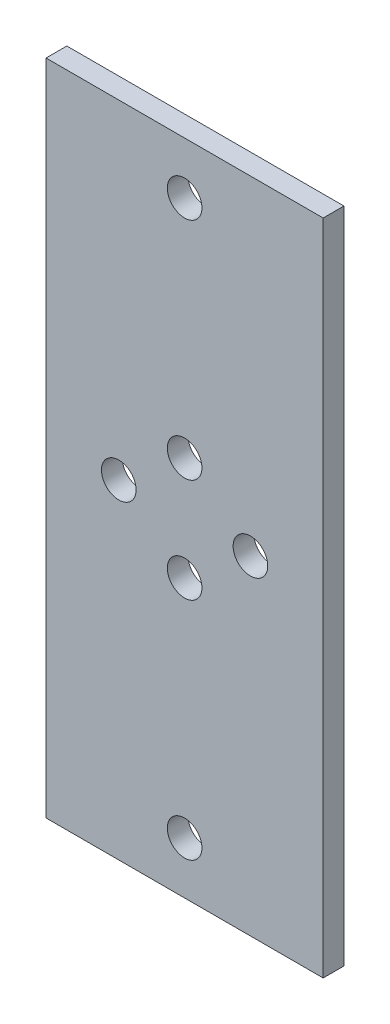
ISO-10303-21;
HEADER;
FILE_DESCRIPTION(('STEP AP214'),'2;1');
FILE_NAME('part.step','',(''),(''),'','','');
FILE_SCHEMA(('AUTOMOTIVE_DESIGN { 1 0 10303 214 1 1 1 1 }'));
ENDSEC;
DATA;
#1=APPLICATION_CONTEXT('core data for automotive mechanical design processes');
#2=APPLICATION_PROTOCOL_DEFINITION('international standard','automotive_design',2000,#1);
#3=PRODUCT_CONTEXT('',#1,'mechanical');
#4=PRODUCT('Part','Part','',(#3));
#5=PRODUCT_RELATED_PRODUCT_CATEGORY('part','',(#4));
#6=PRODUCT_DEFINITION_FORMATION('','',#4);
#7=PRODUCT_DEFINITION_CONTEXT('part definition',#1,'design');
#8=PRODUCT_DEFINITION('design','',#6,#7);
#9=PRODUCT_DEFINITION_SHAPE('','',#8);
#10=(LENGTH_UNIT() NAMED_UNIT(*) SI_UNIT(.MILLI.,.METRE.));
#11=(NAMED_UNIT(*) PLANE_ANGLE_UNIT() SI_UNIT($,.RADIAN.));
#12=(NAMED_UNIT(*) SI_UNIT($,.STERADIAN.) SOLID_ANGLE_UNIT());
#13=UNCERTAINTY_MEASURE_WITH_UNIT(LENGTH_MEASURE(1.E-05),#10,'distance_accuracy_value','');
#14=(GEOMETRIC_REPRESENTATION_CONTEXT(3) GLOBAL_UNCERTAINTY_ASSIGNED_CONTEXT((#13)) GLOBAL_UNIT_ASSIGNED_CONTEXT((#10,
#11,#12)) REPRESENTATION_CONTEXT('',''));
#15=CARTESIAN_POINT('',(0.,0.,0.));
#16=DIRECTION('',(0.,0.,1.));
#17=DIRECTION('',(1.,0.,0.));
#18=AXIS2_PLACEMENT_3D('',#15,#16,#17);
#19=CARTESIAN_POINT('',(0.,0.,3.));
#20=DIRECTION('',(1.,0.,0.));
#21=DIRECTION('',(0.,0.,-1.));
#22=AXIS2_PLACEMENT_3D('',#19,#20,#21);
#23=PLANE('',#22);
#24=DIRECTION('',(0.,-1.,0.));
#25=VECTOR('',#24,1.);
#26=CARTESIAN_POINT('',(0.,0.,0.));
#27=LINE('',#26,#25);
#28=CARTESIAN_POINT('',(0.,95.,0.));
#29=VERTEX_POINT('',#28);
#30=CARTESIAN_POINT('',(0.,0.,0.));
#31=VERTEX_POINT('',#30);
#32=EDGE_CURVE('E100',#29,#31,#27,.T.);
#33=ORIENTED_EDGE('',*,*,#32,.T.);
#34=DIRECTION('',(0.,0.,-1.));
#35=VECTOR('',#34,1.);
#36=CARTESIAN_POINT('',(0.,0.,3.));
#37=LINE('',#36,#35);
#38=CARTESIAN_POINT('',(0.,0.,3.));
#39=VERTEX_POINT('',#38);
#40=EDGE_CURVE('E11',#39,#31,#37,.T.);
#41=ORIENTED_EDGE('',*,*,#40,.F.);
#42=DIRECTION('',(0.,-1.,0.));
#43=VECTOR('',#42,1.);
#44=CARTESIAN_POINT('',(0.,0.,3.));
#45=LINE('',#44,#43);
#46=CARTESIAN_POINT('',(0.,95.,3.));
#47=VERTEX_POINT('',#46);
#48=EDGE_CURVE('E88',#47,#39,#45,.T.);
#49=ORIENTED_EDGE('',*,*,#48,.F.);
#50=DIRECTION('',(0.,0.,-1.));
#51=VECTOR('',#50,1.);
#52=CARTESIAN_POINT('',(0.,95.,3.));
#53=LINE('',#52,#51);
#54=EDGE_CURVE('E96',#47,#29,#53,.T.);
#55=ORIENTED_EDGE('',*,*,#54,.T.);
#56=EDGE_LOOP('',(#33,#41,#49,#55));
#57=FACE_BOUND('',#56,.T.);
#58=ADVANCED_FACE('F37',(#57),#23,.F.);
#59=CARTESIAN_POINT('',(0.,0.,3.));
#60=DIRECTION('',(0.,1.,0.));
#61=DIRECTION('',(0.,0.,1.));
#62=AXIS2_PLACEMENT_3D('',#59,#60,#61);
#63=PLANE('',#62);
#64=DIRECTION('',(1.,0.,0.));
#65=VECTOR('',#64,1.);
#66=CARTESIAN_POINT('',(0.,0.,0.));
#67=LINE('',#66,#65);
#68=CARTESIAN_POINT('',(40.,0.,0.));
#69=VERTEX_POINT('',#68);
#70=EDGE_CURVE('E92',#31,#69,#67,.T.);
#71=ORIENTED_EDGE('',*,*,#70,.T.);
#72=DIRECTION('',(0.,0.,-1.));
#73=VECTOR('',#72,1.);
#74=CARTESIAN_POINT('',(40.,0.,3.));
#75=LINE('',#74,#73);
#76=CARTESIAN_POINT('',(40.,0.,3.));
#77=VERTEX_POINT('',#76);
#78=EDGE_CURVE('E45',#77,#69,#75,.T.);
#79=ORIENTED_EDGE('',*,*,#78,.F.);
#80=DIRECTION('',(1.,0.,0.));
#81=VECTOR('',#80,1.);
#82=CARTESIAN_POINT('',(0.,0.,3.));
#83=LINE('',#82,#81);
#84=EDGE_CURVE('E83',#39,#77,#83,.T.);
#85=ORIENTED_EDGE('',*,*,#84,.F.);
#86=ORIENTED_EDGE('',*,*,#40,.T.);
#87=EDGE_LOOP('',(#71,#79,#85,#86));
#88=FACE_BOUND('',#87,.T.);
#89=ADVANCED_FACE('F91',(#88),#63,.F.);
#90=CARTESIAN_POINT('',(40.,0.,3.));
#91=DIRECTION('',(-1.,0.,0.));
#92=DIRECTION('',(0.,0.,1.));
#93=AXIS2_PLACEMENT_3D('',#90,#91,#92);
#94=PLANE('',#93);
#95=DIRECTION('',(0.,1.,0.));
#96=VECTOR('',#95,1.);
#97=CARTESIAN_POINT('',(40.,0.,0.));
#98=LINE('',#97,#96);
#99=CARTESIAN_POINT('',(40.,95.,0.));
#100=VERTEX_POINT('',#99);
#101=EDGE_CURVE('E70',#69,#100,#98,.T.);
#102=ORIENTED_EDGE('',*,*,#101,.T.);
#103=DIRECTION('',(0.,0.,-1.));
#104=VECTOR('',#103,1.);
#105=CARTESIAN_POINT('',(40.,95.,3.));
#106=LINE('',#105,#104);
#107=CARTESIAN_POINT('',(40.,95.,3.));
#108=VERTEX_POINT('',#107);
#109=EDGE_CURVE('E93',#108,#100,#106,.T.);
#110=ORIENTED_EDGE('',*,*,#109,.F.);
#111=DIRECTION('',(0.,1.,0.));
#112=VECTOR('',#111,1.);
#113=CARTESIAN_POINT('',(40.,0.,3.));
#114=LINE('',#113,#112);
#115=EDGE_CURVE('E86',#77,#108,#114,.T.);
#116=ORIENTED_EDGE('',*,*,#115,.F.);
#117=ORIENTED_EDGE('',*,*,#78,.T.);
#118=EDGE_LOOP('',(#102,#110,#116,#117));
#119=FACE_BOUND('',#118,.T.);
#120=ADVANCED_FACE('F94',(#119),#94,.F.);
#121=CARTESIAN_POINT('',(0.,95.,3.));
#122=DIRECTION('',(0.,-1.,0.));
#123=DIRECTION('',(0.,0.,-1.));
#124=AXIS2_PLACEMENT_3D('',#121,#122,#123);
#125=PLANE('',#124);
#126=DIRECTION('',(-1.,0.,0.));
#127=VECTOR('',#126,1.);
#128=CARTESIAN_POINT('',(0.,95.,0.));
#129=LINE('',#128,#127);
#130=EDGE_CURVE('E76',#100,#29,#129,.T.);
#131=ORIENTED_EDGE('',*,*,#130,.T.);
#132=ORIENTED_EDGE('',*,*,#54,.F.);
#133=DIRECTION('',(-1.,0.,0.));
#134=VECTOR('',#133,1.);
#135=CARTESIAN_POINT('',(0.,95.,3.));
#136=LINE('',#135,#134);
#137=EDGE_CURVE('E53',#108,#47,#136,.T.);
#138=ORIENTED_EDGE('',*,*,#137,.F.);
#139=ORIENTED_EDGE('',*,*,#109,.T.);
#140=EDGE_LOOP('',(#131,#132,#138,#139));
#141=FACE_BOUND('',#140,.T.);
#142=ADVANCED_FACE('F108',(#141),#125,.F.);
#143=CARTESIAN_POINT('',(0.,0.,3.));
#144=DIRECTION('',(0.,0.,-1.));
#145=DIRECTION('',(-1.,0.,0.));
#146=AXIS2_PLACEMENT_3D('',#143,#144,#145);
#147=PLANE('',#146);
#148=CARTESIAN_POINT('',(20.,87.5,3.));
#149=DIRECTION('',(0.,0.,1.));
#150=DIRECTION('',(1.,0.,0.));
#151=AXIS2_PLACEMENT_3D('',#148,#149,#150);
#152=CIRCLE('',#151,2.5);
#153=CARTESIAN_POINT('',(22.5,87.5,3.));
#154=VERTEX_POINT('',#153);
#155=EDGE_CURVE('E103',#154,#154,#152,.T.);
#156=ORIENTED_EDGE('',*,*,#155,.F.);
#157=EDGE_LOOP('',(#156));
#158=FACE_BOUND('',#157,.T.);
#159=CARTESIAN_POINT('',(20.,40.,3.));
#160=DIRECTION('',(0.,0.,1.));
#161=DIRECTION('',(1.,0.,0.));
#162=AXIS2_PLACEMENT_3D('',#159,#160,#161);
#163=CIRCLE('',#162,2.5);
#164=CARTESIAN_POINT('',(22.5,40.,3.));
#165=VERTEX_POINT('',#164);
#166=EDGE_CURVE('E132',#165,#165,#163,.T.);
#167=ORIENTED_EDGE('',*,*,#166,.F.);
#168=EDGE_LOOP('',(#167));
#169=FACE_BOUND('',#168,.T.);
#170=CARTESIAN_POINT('',(20.,7.49999999999998,3.));
#171=DIRECTION('',(0.,0.,1.));
#172=DIRECTION('',(-1.,0.,0.));
#173=AXIS2_PLACEMENT_3D('',#170,#171,#172);
#174=CIRCLE('',#173,2.5);
#175=CARTESIAN_POINT('',(22.5,7.49999999999998,3.));
#176=VERTEX_POINT('',#175);
#177=EDGE_CURVE('E124',#176,#176,#174,.T.);
#178=ORIENTED_EDGE('',*,*,#177,.F.);
#179=EDGE_LOOP('',(#178));
#180=FACE_BOUND('',#179,.T.);
#181=CARTESIAN_POINT('',(10.5,47.5,3.));
#182=DIRECTION('',(0.,0.,1.));
#183=DIRECTION('',(1.,0.,0.));
#184=AXIS2_PLACEMENT_3D('',#181,#182,#183);
#185=CIRCLE('',#184,2.5);
#186=CARTESIAN_POINT('',(13.,47.5,3.));
#187=VERTEX_POINT('',#186);
#188=EDGE_CURVE('E117',#187,#187,#185,.T.);
#189=ORIENTED_EDGE('',*,*,#188,.F.);
#190=EDGE_LOOP('',(#189));
#191=FACE_BOUND('',#190,.T.);
#192=CARTESIAN_POINT('',(29.5,47.5,3.));
#193=DIRECTION('',(0.,0.,1.));
#194=DIRECTION('',(1.,0.,0.));
#195=AXIS2_PLACEMENT_3D('',#192,#193,#194);
#196=CIRCLE('',#195,2.50000000000001);
#197=CARTESIAN_POINT('',(32.,47.5,3.));
#198=VERTEX_POINT('',#197);
#199=EDGE_CURVE('E118',#198,#198,#196,.T.);
#200=ORIENTED_EDGE('',*,*,#199,.F.);
#201=EDGE_LOOP('',(#200));
#202=FACE_BOUND('',#201,.T.);
#203=CARTESIAN_POINT('',(20.,55.,3.));
#204=DIRECTION('',(0.,0.,1.));
#205=DIRECTION('',(1.,0.,0.));
#206=AXIS2_PLACEMENT_3D('',#203,#204,#205);
#207=CIRCLE('',#206,2.5);
#208=CARTESIAN_POINT('',(22.5,55.,3.));
#209=VERTEX_POINT('',#208);
#210=EDGE_CURVE('E131',#209,#209,#207,.T.);
#211=ORIENTED_EDGE('',*,*,#210,.F.);
#212=EDGE_LOOP('',(#211));
#213=FACE_BOUND('',#212,.T.);
#214=ORIENTED_EDGE('',*,*,#48,.T.);
#215=ORIENTED_EDGE('',*,*,#84,.T.);
#216=ORIENTED_EDGE('',*,*,#115,.T.);
#217=ORIENTED_EDGE('',*,*,#137,.T.);
#218=EDGE_LOOP('',(#214,#215,#216,#217));
#219=FACE_BOUND('',#218,.T.);
#220=ADVANCED_FACE('F84',(#158,#169,#180,#191,#202,#213,#219),#147,.F.);
#221=CARTESIAN_POINT('',(0.,0.,0.));
#222=DIRECTION('',(0.,0.,-1.));
#223=DIRECTION('',(-1.,0.,0.));
#224=AXIS2_PLACEMENT_3D('',#221,#222,#223);
#225=PLANE('',#224);
#226=CARTESIAN_POINT('',(20.,87.5,0.));
#227=DIRECTION('',(0.,0.,-1.));
#228=DIRECTION('',(-1.,0.,0.));
#229=AXIS2_PLACEMENT_3D('',#226,#227,#228);
#230=CIRCLE('',#229,2.5);
#231=CARTESIAN_POINT('',(22.5,87.5,0.));
#232=VERTEX_POINT('',#231);
#233=EDGE_CURVE('E127',#232,#232,#230,.F.);
#234=ORIENTED_EDGE('',*,*,#233,.T.);
#235=EDGE_LOOP('',(#234));
#236=FACE_BOUND('',#235,.T.);
#237=CARTESIAN_POINT('',(20.,40.,0.));
#238=DIRECTION('',(0.,0.,-1.));
#239=DIRECTION('',(-1.,0.,0.));
#240=AXIS2_PLACEMENT_3D('',#237,#238,#239);
#241=CIRCLE('',#240,2.5);
#242=CARTESIAN_POINT('',(22.5,40.,0.));
#243=VERTEX_POINT('',#242);
#244=EDGE_CURVE('E140',#243,#243,#241,.F.);
#245=ORIENTED_EDGE('',*,*,#244,.T.);
#246=EDGE_LOOP('',(#245));
#247=FACE_BOUND('',#246,.T.);
#248=CARTESIAN_POINT('',(20.,7.49999999999998,0.));
#249=DIRECTION('',(0.,0.,-1.));
#250=DIRECTION('',(-1.,0.,0.));
#251=AXIS2_PLACEMENT_3D('',#248,#249,#250);
#252=CIRCLE('',#251,2.5);
#253=CARTESIAN_POINT('',(22.5,7.49999999999998,0.));
#254=VERTEX_POINT('',#253);
#255=EDGE_CURVE('E121',#254,#254,#252,.F.);
#256=ORIENTED_EDGE('',*,*,#255,.T.);
#257=EDGE_LOOP('',(#256));
#258=FACE_BOUND('',#257,.T.);
#259=CARTESIAN_POINT('',(10.5,47.5,0.));
#260=DIRECTION('',(0.,0.,-1.));
#261=DIRECTION('',(-1.,0.,0.));
#262=AXIS2_PLACEMENT_3D('',#259,#260,#261);
#263=CIRCLE('',#262,2.5);
#264=CARTESIAN_POINT('',(13.,47.5,0.));
#265=VERTEX_POINT('',#264);
#266=EDGE_CURVE('E114',#265,#265,#263,.F.);
#267=ORIENTED_EDGE('',*,*,#266,.T.);
#268=EDGE_LOOP('',(#267));
#269=FACE_BOUND('',#268,.T.);
#270=CARTESIAN_POINT('',(29.5,47.5,0.));
#271=DIRECTION('',(0.,0.,-1.));
#272=DIRECTION('',(-1.,0.,0.));
#273=AXIS2_PLACEMENT_3D('',#270,#271,#272);
#274=CIRCLE('',#273,2.50000000000001);
#275=CARTESIAN_POINT('',(32.,47.5,0.));
#276=VERTEX_POINT('',#275);
#277=EDGE_CURVE('E135',#276,#276,#274,.F.);
#278=ORIENTED_EDGE('',*,*,#277,.T.);
#279=EDGE_LOOP('',(#278));
#280=FACE_BOUND('',#279,.T.);
#281=CARTESIAN_POINT('',(20.,55.,0.));
#282=DIRECTION('',(0.,0.,-1.));
#283=DIRECTION('',(-1.,0.,0.));
#284=AXIS2_PLACEMENT_3D('',#281,#282,#283);
#285=CIRCLE('',#284,2.5);
#286=CARTESIAN_POINT('',(22.5,55.,0.));
#287=VERTEX_POINT('',#286);
#288=EDGE_CURVE('E128',#287,#287,#285,.F.);
#289=ORIENTED_EDGE('',*,*,#288,.T.);
#290=EDGE_LOOP('',(#289));
#291=FACE_BOUND('',#290,.T.);
#292=ORIENTED_EDGE('',*,*,#32,.F.);
#293=ORIENTED_EDGE('',*,*,#130,.F.);
#294=ORIENTED_EDGE('',*,*,#101,.F.);
#295=ORIENTED_EDGE('',*,*,#70,.F.);
#296=EDGE_LOOP('',(#292,#293,#294,#295));
#297=FACE_BOUND('',#296,.T.);
#298=ADVANCED_FACE('F111',(#236,#247,#258,#269,#280,#291,#297),#225,.T.);
#299=CARTESIAN_POINT('',(20.,55.,-0.00100000000000013));
#300=DIRECTION('',(0.,0.,1.));
#301=DIRECTION('',(1.,0.,0.));
#302=AXIS2_PLACEMENT_3D('',#299,#300,#301);
#303=CYLINDRICAL_SURFACE('',#302,2.5);
#304=CARTESIAN_POINT('',(22.5,55.,0.));
#305=CARTESIAN_POINT('',(22.5,55.,0.03125));
#306=CARTESIAN_POINT('',(22.5,55.,0.0625));
#307=CARTESIAN_POINT('',(22.5,55.,0.125));
#308=CARTESIAN_POINT('',(22.5,55.,0.15625));
#309=CARTESIAN_POINT('',(22.5,55.,0.21875));
#310=CARTESIAN_POINT('',(22.5,55.,0.25));
#311=CARTESIAN_POINT('',(22.5,55.,0.3125));
#312=CARTESIAN_POINT('',(22.5,55.,0.34375));
#313=CARTESIAN_POINT('',(22.5,55.,0.40625));
#314=CARTESIAN_POINT('',(22.5,55.,0.4375));
#315=CARTESIAN_POINT('',(22.5,55.,0.5));
#316=CARTESIAN_POINT('',(22.5,55.,0.53125));
#317=CARTESIAN_POINT('',(22.5,55.,0.59375));
#318=CARTESIAN_POINT('',(22.5,55.,0.625));
#319=CARTESIAN_POINT('',(22.5,55.,0.6875));
#320=CARTESIAN_POINT('',(22.5,55.,0.71875));
#321=CARTESIAN_POINT('',(22.5,55.,0.78125));
#322=CARTESIAN_POINT('',(22.5,55.,0.8125));
#323=CARTESIAN_POINT('',(22.5,55.,0.875));
#324=CARTESIAN_POINT('',(22.5,55.,0.90625));
#325=CARTESIAN_POINT('',(22.5,55.,0.96875));
#326=CARTESIAN_POINT('',(22.5,55.,1.));
#327=CARTESIAN_POINT('',(22.5,55.,1.0625));
#328=CARTESIAN_POINT('',(22.5,55.,1.09375));
#329=CARTESIAN_POINT('',(22.5,55.,1.15625));
#330=CARTESIAN_POINT('',(22.5,55.,1.1875));
#331=CARTESIAN_POINT('',(22.5,55.,1.25));
#332=CARTESIAN_POINT('',(22.5,55.,1.28125));
#333=CARTESIAN_POINT('',(22.5,55.,1.34375));
#334=CARTESIAN_POINT('',(22.5,55.,1.375));
#335=CARTESIAN_POINT('',(22.5,55.,1.4375));
#336=CARTESIAN_POINT('',(22.5,55.,1.46875));
#337=CARTESIAN_POINT('',(22.5,55.,1.53125));
#338=CARTESIAN_POINT('',(22.5,55.,1.5625));
#339=CARTESIAN_POINT('',(22.5,55.,1.625));
#340=CARTESIAN_POINT('',(22.5,55.,1.65625));
#341=CARTESIAN_POINT('',(22.5,55.,1.71875));
#342=CARTESIAN_POINT('',(22.5,55.,1.75));
#343=CARTESIAN_POINT('',(22.5,55.,1.8125));
#344=CARTESIAN_POINT('',(22.5,55.,1.84375));
#345=CARTESIAN_POINT('',(22.5,55.,1.90625));
#346=CARTESIAN_POINT('',(22.5,55.,1.9375));
#347=CARTESIAN_POINT('',(22.5,55.,2.));
#348=CARTESIAN_POINT('',(22.5,55.,2.03125));
#349=CARTESIAN_POINT('',(22.5,55.,2.09375));
#350=CARTESIAN_POINT('',(22.5,55.,2.125));
#351=CARTESIAN_POINT('',(22.5,55.,2.1875));
#352=CARTESIAN_POINT('',(22.5,55.,2.21875));
#353=CARTESIAN_POINT('',(22.5,55.,2.28125));
#354=CARTESIAN_POINT('',(22.5,55.,2.3125));
#355=CARTESIAN_POINT('',(22.5,55.,2.375));
#356=CARTESIAN_POINT('',(22.5,55.,2.40625));
#357=CARTESIAN_POINT('',(22.5,55.,2.46875));
#358=CARTESIAN_POINT('',(22.5,55.,2.5));
#359=CARTESIAN_POINT('',(22.5,55.,2.5625));
#360=CARTESIAN_POINT('',(22.5,55.,2.59375));
#361=CARTESIAN_POINT('',(22.5,55.,2.65625));
#362=CARTESIAN_POINT('',(22.5,55.,2.6875));
#363=CARTESIAN_POINT('',(22.5,55.,2.75));
#364=CARTESIAN_POINT('',(22.5,55.,2.78125));
#365=CARTESIAN_POINT('',(22.5,55.,2.84375));
#366=CARTESIAN_POINT('',(22.5,55.,2.875));
#367=CARTESIAN_POINT('',(22.5,55.,2.9375));
#368=CARTESIAN_POINT('',(22.5,55.,2.96875));
#369=CARTESIAN_POINT('',(22.5,55.,3.));
#370=B_SPLINE_CURVE_WITH_KNOTS('',3,(#304,#305,#306,#307,#308,#309,#310,#311,#312,#313,#314,
#315,#316,#317,#318,#319,#320,#321,#322,#323,#324,#325,#326,#327,#328,#329,#330,#331,#332,#333,
#334,#335,#336,#337,#338,#339,#340,#341,#342,#343,#344,#345,#346,#347,#348,#349,#350,#351,#352,
#353,#354,#355,#356,#357,#358,#359,#360,#361,#362,#363,#364,#365,#366,#367,#368,#369),
.UNSPECIFIED.,.F.,.F.,(4,2,2,2,2,2,2,2,2,2,2,2,2,2,2,2,2,2,2,2,2,2,2,2,2,2,2,2,2,2,2,2,4),(0.,
0.09375,0.1875,0.28125,0.375,0.46875,0.5625,0.65625,0.75,0.84375,0.9375,1.03125,1.125,1.21875,
1.3125,1.40625,1.5,1.59375,1.6875,1.78125,1.875,1.96875,2.0625,2.15625,2.25,2.34375,2.4375,
2.53125,2.625,2.71875,2.8125,2.90625,3.),.UNSPECIFIED.);
#371=EDGE_CURVE('BSEAM165',#287,#209,#370,.T.);
#372=ORIENTED_EDGE('',*,*,#288,.F.);
#373=ORIENTED_EDGE('',*,*,#210,.T.);
#374=ORIENTED_EDGE('',*,*,#371,.T.);
#375=ORIENTED_EDGE('',*,*,#371,.F.);
#376=EDGE_LOOP('',(#372,#374,#373,#375));
#377=FACE_BOUND('',#376,.T.);
#378=ADVANCED_FACE('F165',(#377),#303,.F.);
#379=CARTESIAN_POINT('',(29.5,47.5,-0.00100000000000013));
#380=DIRECTION('',(0.,0.,1.));
#381=DIRECTION('',(1.,0.,0.));
#382=AXIS2_PLACEMENT_3D('',#379,#380,#381);
#383=CYLINDRICAL_SURFACE('',#382,2.50000000000001);
#384=CARTESIAN_POINT('',(32.,47.5,0.));
#385=CARTESIAN_POINT('',(32.,47.5,0.03125));
#386=CARTESIAN_POINT('',(32.,47.5,0.0625));
#387=CARTESIAN_POINT('',(32.,47.5,0.125));
#388=CARTESIAN_POINT('',(32.,47.5,0.15625));
#389=CARTESIAN_POINT('',(32.,47.5,0.21875));
#390=CARTESIAN_POINT('',(32.,47.5,0.25));
#391=CARTESIAN_POINT('',(32.,47.5,0.3125));
#392=CARTESIAN_POINT('',(32.,47.5,0.34375));
#393=CARTESIAN_POINT('',(32.,47.5,0.40625));
#394=CARTESIAN_POINT('',(32.,47.5,0.4375));
#395=CARTESIAN_POINT('',(32.,47.5,0.5));
#396=CARTESIAN_POINT('',(32.,47.5,0.53125));
#397=CARTESIAN_POINT('',(32.,47.5,0.59375));
#398=CARTESIAN_POINT('',(32.,47.5,0.625));
#399=CARTESIAN_POINT('',(32.,47.5,0.6875));
#400=CARTESIAN_POINT('',(32.,47.5,0.71875));
#401=CARTESIAN_POINT('',(32.,47.5,0.78125));
#402=CARTESIAN_POINT('',(32.,47.5,0.8125));
#403=CARTESIAN_POINT('',(32.,47.5,0.875));
#404=CARTESIAN_POINT('',(32.,47.5,0.90625));
#405=CARTESIAN_POINT('',(32.,47.5,0.96875));
#406=CARTESIAN_POINT('',(32.,47.5,1.));
#407=CARTESIAN_POINT('',(32.,47.5,1.0625));
#408=CARTESIAN_POINT('',(32.,47.5,1.09375));
#409=CARTESIAN_POINT('',(32.,47.5,1.15625));
#410=CARTESIAN_POINT('',(32.,47.5,1.1875));
#411=CARTESIAN_POINT('',(32.,47.5,1.25));
#412=CARTESIAN_POINT('',(32.,47.5,1.28125));
#413=CARTESIAN_POINT('',(32.,47.5,1.34375));
#414=CARTESIAN_POINT('',(32.,47.5,1.375));
#415=CARTESIAN_POINT('',(32.,47.5,1.4375));
#416=CARTESIAN_POINT('',(32.,47.5,1.46875));
#417=CARTESIAN_POINT('',(32.,47.5,1.53125));
#418=CARTESIAN_POINT('',(32.,47.5,1.5625));
#419=CARTESIAN_POINT('',(32.,47.5,1.625));
#420=CARTESIAN_POINT('',(32.,47.5,1.65625));
#421=CARTESIAN_POINT('',(32.,47.5,1.71875));
#422=CARTESIAN_POINT('',(32.,47.5,1.75));
#423=CARTESIAN_POINT('',(32.,47.5,1.8125));
#424=CARTESIAN_POINT('',(32.,47.5,1.84375));
#425=CARTESIAN_POINT('',(32.,47.5,1.90625));
#426=CARTESIAN_POINT('',(32.,47.5,1.9375));
#427=CARTESIAN_POINT('',(32.,47.5,2.));
#428=CARTESIAN_POINT('',(32.,47.5,2.03125));
#429=CARTESIAN_POINT('',(32.,47.5,2.09375));
#430=CARTESIAN_POINT('',(32.,47.5,2.125));
#431=CARTESIAN_POINT('',(32.,47.5,2.1875));
#432=CARTESIAN_POINT('',(32.,47.5,2.21875));
#433=CARTESIAN_POINT('',(32.,47.5,2.28125));
#434=CARTESIAN_POINT('',(32.,47.5,2.3125));
#435=CARTESIAN_POINT('',(32.,47.5,2.375));
#436=CARTESIAN_POINT('',(32.,47.5,2.40625));
#437=CARTESIAN_POINT('',(32.,47.5,2.46875));
#438=CARTESIAN_POINT('',(32.,47.5,2.5));
#439=CARTESIAN_POINT('',(32.,47.5,2.5625));
#440=CARTESIAN_POINT('',(32.,47.5,2.59375));
#441=CARTESIAN_POINT('',(32.,47.5,2.65625));
#442=CARTESIAN_POINT('',(32.,47.5,2.6875));
#443=CARTESIAN_POINT('',(32.,47.5,2.75));
#444=CARTESIAN_POINT('',(32.,47.5,2.78125));
#445=CARTESIAN_POINT('',(32.,47.5,2.84375));
#446=CARTESIAN_POINT('',(32.,47.5,2.875));
#447=CARTESIAN_POINT('',(32.,47.5,2.9375));
#448=CARTESIAN_POINT('',(32.,47.5,2.96875));
#449=CARTESIAN_POINT('',(32.,47.5,3.));
#450=B_SPLINE_CURVE_WITH_KNOTS('',3,(#384,#385,#386,#387,#388,#389,#390,#391,#392,#393,#394,
#395,#396,#397,#398,#399,#400,#401,#402,#403,#404,#405,#406,#407,#408,#409,#410,#411,#412,#413,
#414,#415,#416,#417,#418,#419,#420,#421,#422,#423,#424,#425,#426,#427,#428,#429,#430,#431,#432,
#433,#434,#435,#436,#437,#438,#439,#440,#441,#442,#443,#444,#445,#446,#447,#448,#449),
.UNSPECIFIED.,.F.,.F.,(4,2,2,2,2,2,2,2,2,2,2,2,2,2,2,2,2,2,2,2,2,2,2,2,2,2,2,2,2,2,2,2,4),(0.,
0.09375,0.1875,0.28125,0.375,0.46875,0.5625,0.65625,0.75,0.84375,0.9375,1.03125,1.125,1.21875,
1.3125,1.40625,1.5,1.59375,1.6875,1.78125,1.875,1.96875,2.0625,2.15625,2.25,2.34375,2.4375,
2.53125,2.625,2.71875,2.8125,2.90625,3.),.UNSPECIFIED.);
#451=EDGE_CURVE('BSEAM167',#276,#198,#450,.T.);
#452=ORIENTED_EDGE('',*,*,#277,.F.);
#453=ORIENTED_EDGE('',*,*,#199,.T.);
#454=ORIENTED_EDGE('',*,*,#451,.T.);
#455=ORIENTED_EDGE('',*,*,#451,.F.);
#456=EDGE_LOOP('',(#452,#454,#453,#455));
#457=FACE_BOUND('',#456,.T.);
#458=ADVANCED_FACE('F167',(#457),#383,.F.);
#459=CARTESIAN_POINT('',(10.5,47.5,-0.00100000000000013));
#460=DIRECTION('',(0.,0.,1.));
#461=DIRECTION('',(1.,0.,0.));
#462=AXIS2_PLACEMENT_3D('',#459,#460,#461);
#463=CYLINDRICAL_SURFACE('',#462,2.5);
#464=CARTESIAN_POINT('',(13.,47.5,0.));
#465=CARTESIAN_POINT('',(13.,47.5,0.03125));
#466=CARTESIAN_POINT('',(13.,47.5,0.0625));
#467=CARTESIAN_POINT('',(13.,47.5,0.125));
#468=CARTESIAN_POINT('',(13.,47.5,0.15625));
#469=CARTESIAN_POINT('',(13.,47.5,0.21875));
#470=CARTESIAN_POINT('',(13.,47.5,0.25));
#471=CARTESIAN_POINT('',(13.,47.5,0.3125));
#472=CARTESIAN_POINT('',(13.,47.5,0.34375));
#473=CARTESIAN_POINT('',(13.,47.5,0.40625));
#474=CARTESIAN_POINT('',(13.,47.5,0.4375));
#475=CARTESIAN_POINT('',(13.,47.5,0.5));
#476=CARTESIAN_POINT('',(13.,47.5,0.53125));
#477=CARTESIAN_POINT('',(13.,47.5,0.59375));
#478=CARTESIAN_POINT('',(13.,47.5,0.625));
#479=CARTESIAN_POINT('',(13.,47.5,0.6875));
#480=CARTESIAN_POINT('',(13.,47.5,0.71875));
#481=CARTESIAN_POINT('',(13.,47.5,0.78125));
#482=CARTESIAN_POINT('',(13.,47.5,0.8125));
#483=CARTESIAN_POINT('',(13.,47.5,0.875));
#484=CARTESIAN_POINT('',(13.,47.5,0.90625));
#485=CARTESIAN_POINT('',(13.,47.5,0.96875));
#486=CARTESIAN_POINT('',(13.,47.5,1.));
#487=CARTESIAN_POINT('',(13.,47.5,1.0625));
#488=CARTESIAN_POINT('',(13.,47.5,1.09375));
#489=CARTESIAN_POINT('',(13.,47.5,1.15625));
#490=CARTESIAN_POINT('',(13.,47.5,1.1875));
#491=CARTESIAN_POINT('',(13.,47.5,1.25));
#492=CARTESIAN_POINT('',(13.,47.5,1.28125));
#493=CARTESIAN_POINT('',(13.,47.5,1.34375));
#494=CARTESIAN_POINT('',(13.,47.5,1.375));
#495=CARTESIAN_POINT('',(13.,47.5,1.4375));
#496=CARTESIAN_POINT('',(13.,47.5,1.46875));
#497=CARTESIAN_POINT('',(13.,47.5,1.53125));
#498=CARTESIAN_POINT('',(13.,47.5,1.5625));
#499=CARTESIAN_POINT('',(13.,47.5,1.625));
#500=CARTESIAN_POINT('',(13.,47.5,1.65625));
#501=CARTESIAN_POINT('',(13.,47.5,1.71875));
#502=CARTESIAN_POINT('',(13.,47.5,1.75));
#503=CARTESIAN_POINT('',(13.,47.5,1.8125));
#504=CARTESIAN_POINT('',(13.,47.5,1.84375));
#505=CARTESIAN_POINT('',(13.,47.5,1.90625));
#506=CARTESIAN_POINT('',(13.,47.5,1.9375));
#507=CARTESIAN_POINT('',(13.,47.5,2.));
#508=CARTESIAN_POINT('',(13.,47.5,2.03125));
#509=CARTESIAN_POINT('',(13.,47.5,2.09375));
#510=CARTESIAN_POINT('',(13.,47.5,2.125));
#511=CARTESIAN_POINT('',(13.,47.5,2.1875));
#512=CARTESIAN_POINT('',(13.,47.5,2.21875));
#513=CARTESIAN_POINT('',(13.,47.5,2.28125));
#514=CARTESIAN_POINT('',(13.,47.5,2.3125));
#515=CARTESIAN_POINT('',(13.,47.5,2.375));
#516=CARTESIAN_POINT('',(13.,47.5,2.40625));
#517=CARTESIAN_POINT('',(13.,47.5,2.46875));
#518=CARTESIAN_POINT('',(13.,47.5,2.5));
#519=CARTESIAN_POINT('',(13.,47.5,2.5625));
#520=CARTESIAN_POINT('',(13.,47.5,2.59375));
#521=CARTESIAN_POINT('',(13.,47.5,2.65625));
#522=CARTESIAN_POINT('',(13.,47.5,2.6875));
#523=CARTESIAN_POINT('',(13.,47.5,2.75));
#524=CARTESIAN_POINT('',(13.,47.5,2.78125));
#525=CARTESIAN_POINT('',(13.,47.5,2.84375));
#526=CARTESIAN_POINT('',(13.,47.5,2.875));
#527=CARTESIAN_POINT('',(13.,47.5,2.9375));
#528=CARTESIAN_POINT('',(13.,47.5,2.96875));
#529=CARTESIAN_POINT('',(13.,47.5,3.));
#530=B_SPLINE_CURVE_WITH_KNOTS('',3,(#464,#465,#466,#467,#468,#469,#470,#471,#472,#473,#474,
#475,#476,#477,#478,#479,#480,#481,#482,#483,#484,#485,#486,#487,#488,#489,#490,#491,#492,#493,
#494,#495,#496,#497,#498,#499,#500,#501,#502,#503,#504,#505,#506,#507,#508,#509,#510,#511,#512,
#513,#514,#515,#516,#517,#518,#519,#520,#521,#522,#523,#524,#525,#526,#527,#528,#529),
.UNSPECIFIED.,.F.,.F.,(4,2,2,2,2,2,2,2,2,2,2,2,2,2,2,2,2,2,2,2,2,2,2,2,2,2,2,2,2,2,2,2,4),(0.,
0.09375,0.1875,0.28125,0.375,0.46875,0.5625,0.65625,0.75,0.84375,0.9375,1.03125,1.125,1.21875,
1.3125,1.40625,1.5,1.59375,1.6875,1.78125,1.875,1.96875,2.0625,2.15625,2.25,2.34375,2.4375,
2.53125,2.625,2.71875,2.8125,2.90625,3.),.UNSPECIFIED.);
#531=EDGE_CURVE('BSEAM174',#265,#187,#530,.T.);
#532=ORIENTED_EDGE('',*,*,#266,.F.);
#533=ORIENTED_EDGE('',*,*,#188,.T.);
#534=ORIENTED_EDGE('',*,*,#531,.T.);
#535=ORIENTED_EDGE('',*,*,#531,.F.);
#536=EDGE_LOOP('',(#532,#534,#533,#535));
#537=FACE_BOUND('',#536,.T.);
#538=ADVANCED_FACE('F174',(#537),#463,.F.);
#539=CARTESIAN_POINT('',(20.,7.49999999999998,-0.00100000000000013));
#540=DIRECTION('',(0.,0.,1.));
#541=DIRECTION('',(1.,0.,0.));
#542=AXIS2_PLACEMENT_3D('',#539,#540,#541);
#543=CYLINDRICAL_SURFACE('',#542,2.5);
#544=CARTESIAN_POINT('',(22.5,7.49999999999998,0.));
#545=CARTESIAN_POINT('',(22.5,7.49999999999998,0.03125));
#546=CARTESIAN_POINT('',(22.5,7.49999999999998,0.0625));
#547=CARTESIAN_POINT('',(22.5,7.49999999999998,0.125));
#548=CARTESIAN_POINT('',(22.5,7.49999999999998,0.15625));
#549=CARTESIAN_POINT('',(22.5,7.49999999999998,0.21875));
#550=CARTESIAN_POINT('',(22.5,7.49999999999998,0.25));
#551=CARTESIAN_POINT('',(22.5,7.49999999999998,0.3125));
#552=CARTESIAN_POINT('',(22.5,7.49999999999998,0.34375));
#553=CARTESIAN_POINT('',(22.5,7.49999999999998,0.40625));
#554=CARTESIAN_POINT('',(22.5,7.49999999999998,0.4375));
#555=CARTESIAN_POINT('',(22.5,7.49999999999998,0.5));
#556=CARTESIAN_POINT('',(22.5,7.49999999999998,0.53125));
#557=CARTESIAN_POINT('',(22.5,7.49999999999998,0.59375));
#558=CARTESIAN_POINT('',(22.5,7.49999999999998,0.625));
#559=CARTESIAN_POINT('',(22.5,7.49999999999998,0.6875));
#560=CARTESIAN_POINT('',(22.5,7.49999999999998,0.71875));
#561=CARTESIAN_POINT('',(22.5,7.49999999999998,0.78125));
#562=CARTESIAN_POINT('',(22.5,7.49999999999998,0.8125));
#563=CARTESIAN_POINT('',(22.5,7.49999999999998,0.875));
#564=CARTESIAN_POINT('',(22.5,7.49999999999998,0.90625));
#565=CARTESIAN_POINT('',(22.5,7.49999999999998,0.96875));
#566=CARTESIAN_POINT('',(22.5,7.49999999999998,1.));
#567=CARTESIAN_POINT('',(22.5,7.49999999999998,1.0625));
#568=CARTESIAN_POINT('',(22.5,7.49999999999998,1.09375));
#569=CARTESIAN_POINT('',(22.5,7.49999999999998,1.15625));
#570=CARTESIAN_POINT('',(22.5,7.49999999999998,1.1875));
#571=CARTESIAN_POINT('',(22.5,7.49999999999998,1.25));
#572=CARTESIAN_POINT('',(22.5,7.49999999999998,1.28125));
#573=CARTESIAN_POINT('',(22.5,7.49999999999998,1.34375));
#574=CARTESIAN_POINT('',(22.5,7.49999999999998,1.375));
#575=CARTESIAN_POINT('',(22.5,7.49999999999998,1.4375));
#576=CARTESIAN_POINT('',(22.5,7.49999999999998,1.46875));
#577=CARTESIAN_POINT('',(22.5,7.49999999999998,1.53125));
#578=CARTESIAN_POINT('',(22.5,7.49999999999998,1.5625));
#579=CARTESIAN_POINT('',(22.5,7.49999999999998,1.625));
#580=CARTESIAN_POINT('',(22.5,7.49999999999998,1.65625));
#581=CARTESIAN_POINT('',(22.5,7.49999999999998,1.71875));
#582=CARTESIAN_POINT('',(22.5,7.49999999999998,1.75));
#583=CARTESIAN_POINT('',(22.5,7.49999999999998,1.8125));
#584=CARTESIAN_POINT('',(22.5,7.49999999999998,1.84375));
#585=CARTESIAN_POINT('',(22.5,7.49999999999998,1.90625));
#586=CARTESIAN_POINT('',(22.5,7.49999999999998,1.9375));
#587=CARTESIAN_POINT('',(22.5,7.49999999999998,2.));
#588=CARTESIAN_POINT('',(22.5,7.49999999999998,2.03125));
#589=CARTESIAN_POINT('',(22.5,7.49999999999998,2.09375));
#590=CARTESIAN_POINT('',(22.5,7.49999999999998,2.125));
#591=CARTESIAN_POINT('',(22.5,7.49999999999998,2.1875));
#592=CARTESIAN_POINT('',(22.5,7.49999999999998,2.21875));
#593=CARTESIAN_POINT('',(22.5,7.49999999999998,2.28125));
#594=CARTESIAN_POINT('',(22.5,7.49999999999998,2.3125));
#595=CARTESIAN_POINT('',(22.5,7.49999999999998,2.375));
#596=CARTESIAN_POINT('',(22.5,7.49999999999998,2.40625));
#597=CARTESIAN_POINT('',(22.5,7.49999999999998,2.46875));
#598=CARTESIAN_POINT('',(22.5,7.49999999999998,2.5));
#599=CARTESIAN_POINT('',(22.5,7.49999999999998,2.5625));
#600=CARTESIAN_POINT('',(22.5,7.49999999999998,2.59375));
#601=CARTESIAN_POINT('',(22.5,7.49999999999998,2.65625));
#602=CARTESIAN_POINT('',(22.5,7.49999999999998,2.6875));
#603=CARTESIAN_POINT('',(22.5,7.49999999999998,2.75));
#604=CARTESIAN_POINT('',(22.5,7.49999999999998,2.78125));
#605=CARTESIAN_POINT('',(22.5,7.49999999999998,2.84375));
#606=CARTESIAN_POINT('',(22.5,7.49999999999998,2.875));
#607=CARTESIAN_POINT('',(22.5,7.49999999999998,2.9375));
#608=CARTESIAN_POINT('',(22.5,7.49999999999998,2.96875));
#609=CARTESIAN_POINT('',(22.5,7.49999999999998,3.));
#610=B_SPLINE_CURVE_WITH_KNOTS('',3,(#544,#545,#546,#547,#548,#549,#550,#551,#552,#553,#554,
#555,#556,#557,#558,#559,#560,#561,#562,#563,#564,#565,#566,#567,#568,#569,#570,#571,#572,#573,
#574,#575,#576,#577,#578,#579,#580,#581,#582,#583,#584,#585,#586,#587,#588,#589,#590,#591,#592,
#593,#594,#595,#596,#597,#598,#599,#600,#601,#602,#603,#604,#605,#606,#607,#608,#609),
.UNSPECIFIED.,.F.,.F.,(4,2,2,2,2,2,2,2,2,2,2,2,2,2,2,2,2,2,2,2,2,2,2,2,2,2,2,2,2,2,2,2,4),(0.,
0.09375,0.1875,0.28125,0.375,0.46875,0.5625,0.65625,0.75,0.84375,0.9375,1.03125,1.125,1.21875,
1.3125,1.40625,1.5,1.59375,1.6875,1.78125,1.875,1.96875,2.0625,2.15625,2.25,2.34375,2.4375,
2.53125,2.625,2.71875,2.8125,2.90625,3.),.UNSPECIFIED.);
#611=EDGE_CURVE('BSEAM193',#254,#176,#610,.T.);
#612=ORIENTED_EDGE('',*,*,#255,.F.);
#613=ORIENTED_EDGE('',*,*,#177,.T.);
#614=ORIENTED_EDGE('',*,*,#611,.T.);
#615=ORIENTED_EDGE('',*,*,#611,.F.);
#616=EDGE_LOOP('',(#612,#614,#613,#615));
#617=FACE_BOUND('',#616,.T.);
#618=ADVANCED_FACE('F193',(#617),#543,.F.);
#619=CARTESIAN_POINT('',(20.,40.,-0.00100000000000013));
#620=DIRECTION('',(0.,0.,1.));
#621=DIRECTION('',(1.,0.,0.));
#622=AXIS2_PLACEMENT_3D('',#619,#620,#621);
#623=CYLINDRICAL_SURFACE('',#622,2.5);
#624=CARTESIAN_POINT('',(22.5,40.,0.));
#625=CARTESIAN_POINT('',(22.5,40.,0.03125));
#626=CARTESIAN_POINT('',(22.5,40.,0.0625));
#627=CARTESIAN_POINT('',(22.5,40.,0.125));
#628=CARTESIAN_POINT('',(22.5,40.,0.15625));
#629=CARTESIAN_POINT('',(22.5,40.,0.21875));
#630=CARTESIAN_POINT('',(22.5,40.,0.25));
#631=CARTESIAN_POINT('',(22.5,40.,0.3125));
#632=CARTESIAN_POINT('',(22.5,40.,0.34375));
#633=CARTESIAN_POINT('',(22.5,40.,0.40625));
#634=CARTESIAN_POINT('',(22.5,40.,0.4375));
#635=CARTESIAN_POINT('',(22.5,40.,0.5));
#636=CARTESIAN_POINT('',(22.5,40.,0.53125));
#637=CARTESIAN_POINT('',(22.5,40.,0.59375));
#638=CARTESIAN_POINT('',(22.5,40.,0.625));
#639=CARTESIAN_POINT('',(22.5,40.,0.6875));
#640=CARTESIAN_POINT('',(22.5,40.,0.71875));
#641=CARTESIAN_POINT('',(22.5,40.,0.78125));
#642=CARTESIAN_POINT('',(22.5,40.,0.8125));
#643=CARTESIAN_POINT('',(22.5,40.,0.875));
#644=CARTESIAN_POINT('',(22.5,40.,0.90625));
#645=CARTESIAN_POINT('',(22.5,40.,0.96875));
#646=CARTESIAN_POINT('',(22.5,40.,1.));
#647=CARTESIAN_POINT('',(22.5,40.,1.0625));
#648=CARTESIAN_POINT('',(22.5,40.,1.09375));
#649=CARTESIAN_POINT('',(22.5,40.,1.15625));
#650=CARTESIAN_POINT('',(22.5,40.,1.1875));
#651=CARTESIAN_POINT('',(22.5,40.,1.25));
#652=CARTESIAN_POINT('',(22.5,40.,1.28125));
#653=CARTESIAN_POINT('',(22.5,40.,1.34375));
#654=CARTESIAN_POINT('',(22.5,40.,1.375));
#655=CARTESIAN_POINT('',(22.5,40.,1.4375));
#656=CARTESIAN_POINT('',(22.5,40.,1.46875));
#657=CARTESIAN_POINT('',(22.5,40.,1.53125));
#658=CARTESIAN_POINT('',(22.5,40.,1.5625));
#659=CARTESIAN_POINT('',(22.5,40.,1.625));
#660=CARTESIAN_POINT('',(22.5,40.,1.65625));
#661=CARTESIAN_POINT('',(22.5,40.,1.71875));
#662=CARTESIAN_POINT('',(22.5,40.,1.75));
#663=CARTESIAN_POINT('',(22.5,40.,1.8125));
#664=CARTESIAN_POINT('',(22.5,40.,1.84375));
#665=CARTESIAN_POINT('',(22.5,40.,1.90625));
#666=CARTESIAN_POINT('',(22.5,40.,1.9375));
#667=CARTESIAN_POINT('',(22.5,40.,2.));
#668=CARTESIAN_POINT('',(22.5,40.,2.03125));
#669=CARTESIAN_POINT('',(22.5,40.,2.09375));
#670=CARTESIAN_POINT('',(22.5,40.,2.125));
#671=CARTESIAN_POINT('',(22.5,40.,2.1875));
#672=CARTESIAN_POINT('',(22.5,40.,2.21875));
#673=CARTESIAN_POINT('',(22.5,40.,2.28125));
#674=CARTESIAN_POINT('',(22.5,40.,2.3125));
#675=CARTESIAN_POINT('',(22.5,40.,2.375));
#676=CARTESIAN_POINT('',(22.5,40.,2.40625));
#677=CARTESIAN_POINT('',(22.5,40.,2.46875));
#678=CARTESIAN_POINT('',(22.5,40.,2.5));
#679=CARTESIAN_POINT('',(22.5,40.,2.5625));
#680=CARTESIAN_POINT('',(22.5,40.,2.59375));
#681=CARTESIAN_POINT('',(22.5,40.,2.65625));
#682=CARTESIAN_POINT('',(22.5,40.,2.6875));
#683=CARTESIAN_POINT('',(22.5,40.,2.75));
#684=CARTESIAN_POINT('',(22.5,40.,2.78125));
#685=CARTESIAN_POINT('',(22.5,40.,2.84375));
#686=CARTESIAN_POINT('',(22.5,40.,2.875));
#687=CARTESIAN_POINT('',(22.5,40.,2.9375));
#688=CARTESIAN_POINT('',(22.5,40.,2.96875));
#689=CARTESIAN_POINT('',(22.5,40.,3.));
#690=B_SPLINE_CURVE_WITH_KNOTS('',3,(#624,#625,#626,#627,#628,#629,#630,#631,#632,#633,#634,
#635,#636,#637,#638,#639,#640,#641,#642,#643,#644,#645,#646,#647,#648,#649,#650,#651,#652,#653,
#654,#655,#656,#657,#658,#659,#660,#661,#662,#663,#664,#665,#666,#667,#668,#669,#670,#671,#672,
#673,#674,#675,#676,#677,#678,#679,#680,#681,#682,#683,#684,#685,#686,#687,#688,#689),
.UNSPECIFIED.,.F.,.F.,(4,2,2,2,2,2,2,2,2,2,2,2,2,2,2,2,2,2,2,2,2,2,2,2,2,2,2,2,2,2,2,2,4),(0.,
0.09375,0.1875,0.28125,0.375,0.46875,0.5625,0.65625,0.75,0.84375,0.9375,1.03125,1.125,1.21875,
1.3125,1.40625,1.5,1.59375,1.6875,1.78125,1.875,1.96875,2.0625,2.15625,2.25,2.34375,2.4375,
2.53125,2.625,2.71875,2.8125,2.90625,3.),.UNSPECIFIED.);
#691=EDGE_CURVE('BSEAM196',#243,#165,#690,.T.);
#692=ORIENTED_EDGE('',*,*,#244,.F.);
#693=ORIENTED_EDGE('',*,*,#166,.T.);
#694=ORIENTED_EDGE('',*,*,#691,.T.);
#695=ORIENTED_EDGE('',*,*,#691,.F.);
#696=EDGE_LOOP('',(#692,#694,#693,#695));
#697=FACE_BOUND('',#696,.T.);
#698=ADVANCED_FACE('F196',(#697),#623,.F.);
#699=CARTESIAN_POINT('',(20.,87.5,-0.00100000000000013));
#700=DIRECTION('',(0.,0.,1.));
#701=DIRECTION('',(1.,0.,0.));
#702=AXIS2_PLACEMENT_3D('',#699,#700,#701);
#703=CYLINDRICAL_SURFACE('',#702,2.5);
#704=CARTESIAN_POINT('',(22.5,87.5,0.));
#705=CARTESIAN_POINT('',(22.5,87.5,0.03125));
#706=CARTESIAN_POINT('',(22.5,87.5,0.0625));
#707=CARTESIAN_POINT('',(22.5,87.5,0.125));
#708=CARTESIAN_POINT('',(22.5,87.5,0.15625));
#709=CARTESIAN_POINT('',(22.5,87.5,0.21875));
#710=CARTESIAN_POINT('',(22.5,87.5,0.25));
#711=CARTESIAN_POINT('',(22.5,87.5,0.3125));
#712=CARTESIAN_POINT('',(22.5,87.5,0.34375));
#713=CARTESIAN_POINT('',(22.5,87.5,0.40625));
#714=CARTESIAN_POINT('',(22.5,87.5,0.4375));
#715=CARTESIAN_POINT('',(22.5,87.5,0.5));
#716=CARTESIAN_POINT('',(22.5,87.5,0.53125));
#717=CARTESIAN_POINT('',(22.5,87.5,0.59375));
#718=CARTESIAN_POINT('',(22.5,87.5,0.625));
#719=CARTESIAN_POINT('',(22.5,87.5,0.6875));
#720=CARTESIAN_POINT('',(22.5,87.5,0.71875));
#721=CARTESIAN_POINT('',(22.5,87.5,0.78125));
#722=CARTESIAN_POINT('',(22.5,87.5,0.8125));
#723=CARTESIAN_POINT('',(22.5,87.5,0.875));
#724=CARTESIAN_POINT('',(22.5,87.5,0.90625));
#725=CARTESIAN_POINT('',(22.5,87.5,0.96875));
#726=CARTESIAN_POINT('',(22.5,87.5,1.));
#727=CARTESIAN_POINT('',(22.5,87.5,1.0625));
#728=CARTESIAN_POINT('',(22.5,87.5,1.09375));
#729=CARTESIAN_POINT('',(22.5,87.5,1.15625));
#730=CARTESIAN_POINT('',(22.5,87.5,1.1875));
#731=CARTESIAN_POINT('',(22.5,87.5,1.25));
#732=CARTESIAN_POINT('',(22.5,87.5,1.28125));
#733=CARTESIAN_POINT('',(22.5,87.5,1.34375));
#734=CARTESIAN_POINT('',(22.5,87.5,1.375));
#735=CARTESIAN_POINT('',(22.5,87.5,1.4375));
#736=CARTESIAN_POINT('',(22.5,87.5,1.46875));
#737=CARTESIAN_POINT('',(22.5,87.5,1.53125));
#738=CARTESIAN_POINT('',(22.5,87.5,1.5625));
#739=CARTESIAN_POINT('',(22.5,87.5,1.625));
#740=CARTESIAN_POINT('',(22.5,87.5,1.65625));
#741=CARTESIAN_POINT('',(22.5,87.5,1.71875));
#742=CARTESIAN_POINT('',(22.5,87.5,1.75));
#743=CARTESIAN_POINT('',(22.5,87.5,1.8125));
#744=CARTESIAN_POINT('',(22.5,87.5,1.84375));
#745=CARTESIAN_POINT('',(22.5,87.5,1.90625));
#746=CARTESIAN_POINT('',(22.5,87.5,1.9375));
#747=CARTESIAN_POINT('',(22.5,87.5,2.));
#748=CARTESIAN_POINT('',(22.5,87.5,2.03125));
#749=CARTESIAN_POINT('',(22.5,87.5,2.09375));
#750=CARTESIAN_POINT('',(22.5,87.5,2.125));
#751=CARTESIAN_POINT('',(22.5,87.5,2.1875));
#752=CARTESIAN_POINT('',(22.5,87.5,2.21875));
#753=CARTESIAN_POINT('',(22.5,87.5,2.28125));
#754=CARTESIAN_POINT('',(22.5,87.5,2.3125));
#755=CARTESIAN_POINT('',(22.5,87.5,2.375));
#756=CARTESIAN_POINT('',(22.5,87.5,2.40625));
#757=CARTESIAN_POINT('',(22.5,87.5,2.46875));
#758=CARTESIAN_POINT('',(22.5,87.5,2.5));
#759=CARTESIAN_POINT('',(22.5,87.5,2.5625));
#760=CARTESIAN_POINT('',(22.5,87.5,2.59375));
#761=CARTESIAN_POINT('',(22.5,87.5,2.65625));
#762=CARTESIAN_POINT('',(22.5,87.5,2.6875));
#763=CARTESIAN_POINT('',(22.5,87.5,2.75));
#764=CARTESIAN_POINT('',(22.5,87.5,2.78125));
#765=CARTESIAN_POINT('',(22.5,87.5,2.84375));
#766=CARTESIAN_POINT('',(22.5,87.5,2.875));
#767=CARTESIAN_POINT('',(22.5,87.5,2.9375));
#768=CARTESIAN_POINT('',(22.5,87.5,2.96875));
#769=CARTESIAN_POINT('',(22.5,87.5,3.));
#770=B_SPLINE_CURVE_WITH_KNOTS('',3,(#704,#705,#706,#707,#708,#709,#710,#711,#712,#713,#714,
#715,#716,#717,#718,#719,#720,#721,#722,#723,#724,#725,#726,#727,#728,#729,#730,#731,#732,#733,
#734,#735,#736,#737,#738,#739,#740,#741,#742,#743,#744,#745,#746,#747,#748,#749,#750,#751,#752,
#753,#754,#755,#756,#757,#758,#759,#760,#761,#762,#763,#764,#765,#766,#767,#768,#769),
.UNSPECIFIED.,.F.,.F.,(4,2,2,2,2,2,2,2,2,2,2,2,2,2,2,2,2,2,2,2,2,2,2,2,2,2,2,2,2,2,2,2,4),(0.,
0.09375,0.1875,0.28125,0.375,0.46875,0.5625,0.65625,0.75,0.84375,0.9375,1.03125,1.125,1.21875,
1.3125,1.40625,1.5,1.59375,1.6875,1.78125,1.875,1.96875,2.0625,2.15625,2.25,2.34375,2.4375,
2.53125,2.625,2.71875,2.8125,2.90625,3.),.UNSPECIFIED.);
#771=EDGE_CURVE('BSEAM150',#232,#154,#770,.T.);
#772=ORIENTED_EDGE('',*,*,#233,.F.);
#773=ORIENTED_EDGE('',*,*,#155,.T.);
#774=ORIENTED_EDGE('',*,*,#771,.T.);
#775=ORIENTED_EDGE('',*,*,#771,.F.);
#776=EDGE_LOOP('',(#772,#774,#773,#775));
#777=FACE_BOUND('',#776,.T.);
#778=ADVANCED_FACE('F150',(#777),#703,.F.);
#779=CLOSED_SHELL('',(#58,#89,#120,#142,#220,#298,#378,#458,#538,#618,#698,#778));
#780=MANIFOLD_SOLID_BREP('B2',#779);
#781=ADVANCED_BREP_SHAPE_REPRESENTATION('',(#18,#780),#14);
#782=SHAPE_DEFINITION_REPRESENTATION(#9,#781);
ENDSEC;
END-ISO-10303-21;
